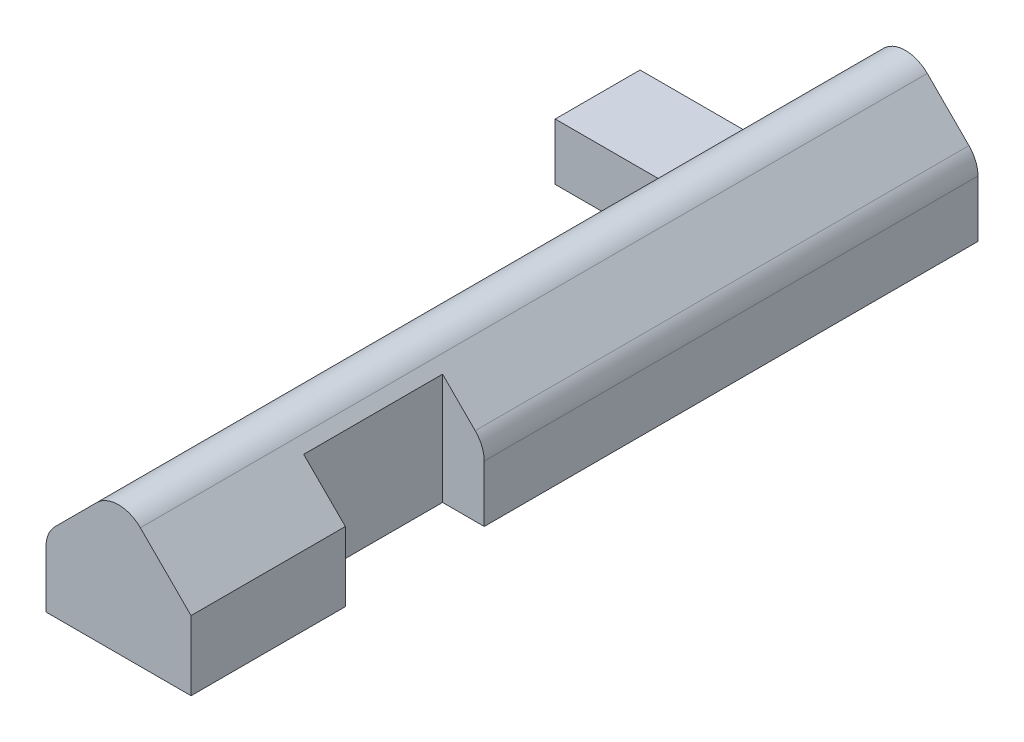
ISO-10303-21;
HEADER;
FILE_DESCRIPTION(('STEP AP214'),'2;1');
FILE_NAME('part.step','',(''),(''),'','','');
FILE_SCHEMA(('AUTOMOTIVE_DESIGN { 1 0 10303 214 1 1 1 1 }'));
ENDSEC;
DATA;
#1=APPLICATION_CONTEXT('core data for automotive mechanical design processes');
#2=APPLICATION_PROTOCOL_DEFINITION('international standard','automotive_design',2000,#1);
#3=PRODUCT_CONTEXT('',#1,'mechanical');
#4=PRODUCT('Part','Part','',(#3));
#5=PRODUCT_RELATED_PRODUCT_CATEGORY('part','',(#4));
#6=PRODUCT_DEFINITION_FORMATION('','',#4);
#7=PRODUCT_DEFINITION_CONTEXT('part definition',#1,'design');
#8=PRODUCT_DEFINITION('design','',#6,#7);
#9=PRODUCT_DEFINITION_SHAPE('','',#8);
#10=(LENGTH_UNIT() NAMED_UNIT(*) SI_UNIT(.MILLI.,.METRE.));
#11=(NAMED_UNIT(*) PLANE_ANGLE_UNIT() SI_UNIT($,.RADIAN.));
#12=(NAMED_UNIT(*) SI_UNIT($,.STERADIAN.) SOLID_ANGLE_UNIT());
#13=UNCERTAINTY_MEASURE_WITH_UNIT(LENGTH_MEASURE(1.E-05),#10,'distance_accuracy_value','');
#14=(GEOMETRIC_REPRESENTATION_CONTEXT(3) GLOBAL_UNCERTAINTY_ASSIGNED_CONTEXT((#13)) GLOBAL_UNIT_ASSIGNED_CONTEXT((#10,
#11,#12)) REPRESENTATION_CONTEXT('',''));
#15=CARTESIAN_POINT('',(0.,0.,0.));
#16=DIRECTION('',(0.,0.,1.));
#17=DIRECTION('',(1.,0.,0.));
#18=AXIS2_PLACEMENT_3D('',#15,#16,#17);
#19=CARTESIAN_POINT('',(-4.7,0.,51.));
#20=DIRECTION('',(1.,0.,0.));
#21=DIRECTION('',(0.,0.,-1.));
#22=AXIS2_PLACEMENT_3D('',#19,#20,#21);
#23=PLANE('',#22);
#24=DIRECTION('',(0.,0.,-1.));
#25=VECTOR('',#24,1.);
#26=CARTESIAN_POINT('',(-4.7,-2.25,51.));
#27=LINE('',#26,#25);
#28=CARTESIAN_POINT('',(-4.7,-2.25,5.));
#29=VERTEX_POINT('',#28);
#30=CARTESIAN_POINT('',(-4.7,-2.25,0.));
#31=VERTEX_POINT('',#30);
#32=EDGE_CURVE('E56',#29,#31,#27,.T.);
#33=ORIENTED_EDGE('',*,*,#32,.F.);
#34=DIRECTION('',(0.,-1.,0.));
#35=VECTOR('',#34,1.);
#36=CARTESIAN_POINT('',(-4.7,1.42157287525381,5.));
#37=LINE('',#36,#35);
#38=CARTESIAN_POINT('',(-4.7,1.42157287525381,5.));
#39=VERTEX_POINT('',#38);
#40=EDGE_CURVE('E189',#39,#29,#37,.T.);
#41=ORIENTED_EDGE('',*,*,#40,.F.);
#42=DIRECTION('',(0.,0.,-1.));
#43=VECTOR('',#42,1.);
#44=CARTESIAN_POINT('',(-4.7,1.42157287525381,0.));
#45=LINE('',#44,#43);
#46=CARTESIAN_POINT('',(-4.7,1.42157287525381,0.));
#47=VERTEX_POINT('',#46);
#48=EDGE_CURVE('E267',#39,#47,#45,.T.);
#49=ORIENTED_EDGE('',*,*,#48,.T.);
#50=DIRECTION('',(0.,-1.,0.));
#51=VECTOR('',#50,1.);
#52=CARTESIAN_POINT('',(-4.7,0.,0.));
#53=LINE('',#52,#51);
#54=EDGE_CURVE('E232',#47,#31,#53,.T.);
#55=ORIENTED_EDGE('',*,*,#54,.T.);
#56=EDGE_LOOP('',(#33,#41,#49,#55));
#57=FACE_BOUND('',#56,.T.);
#58=ADVANCED_FACE('F41',(#57),#23,.F.);
#59=CARTESIAN_POINT('',(3.47500000000001,3.475,51.));
#60=DIRECTION('',(0.707106781186549,0.707106781186546,0.));
#61=DIRECTION('',(-0.707106781186546,0.707106781186549,0.));
#62=AXIS2_PLACEMENT_3D('',#59,#60,#61);
#63=PLANE('',#62);
#64=DIRECTION('',(-0.707106781186546,0.707106781186549,0.));
#65=VECTOR('',#64,1.);
#66=CARTESIAN_POINT('',(3.47500000000001,3.475,32.));
#67=LINE('',#66,#65);
#68=CARTESIAN_POINT('',(4.1142135623731,2.83578643762691,32.));
#69=VERTEX_POINT('',#68);
#70=CARTESIAN_POINT('',(2.,4.95000000000001,32.));
#71=VERTEX_POINT('',#70);
#72=EDGE_CURVE('E204',#69,#71,#67,.T.);
#73=ORIENTED_EDGE('',*,*,#72,.F.);
#74=DIRECTION('',(0.,0.,-1.));
#75=VECTOR('',#74,1.);
#76=CARTESIAN_POINT('',(4.1142135623731,2.83578643762691,51.));
#77=LINE('',#76,#75);
#78=CARTESIAN_POINT('',(4.1142135623731,2.83578643762691,0.));
#79=VERTEX_POINT('',#78);
#80=EDGE_CURVE('E254',#69,#79,#77,.T.);
#81=ORIENTED_EDGE('',*,*,#80,.T.);
#82=DIRECTION('',(0.707106781186546,-0.707106781186549,0.));
#83=VECTOR('',#82,1.);
#84=CARTESIAN_POINT('',(3.47500000000001,3.475,0.));
#85=LINE('',#84,#83);
#86=CARTESIAN_POINT('',(1.4142135623731,5.53578643762692,0.));
#87=VERTEX_POINT('',#86);
#88=EDGE_CURVE('E212',#87,#79,#85,.T.);
#89=ORIENTED_EDGE('',*,*,#88,.F.);
#90=DIRECTION('',(0.,0.,-1.));
#91=VECTOR('',#90,1.);
#92=CARTESIAN_POINT('',(1.4142135623731,5.53578643762692,51.));
#93=LINE('',#92,#91);
#94=CARTESIAN_POINT('',(1.4142135623731,5.53578643762692,51.));
#95=VERTEX_POINT('',#94);
#96=EDGE_CURVE('E252',#87,#95,#93,.F.);
#97=ORIENTED_EDGE('',*,*,#96,.T.);
#98=DIRECTION('',(0.707106781186546,-0.707106781186549,0.));
#99=VECTOR('',#98,1.);
#100=CARTESIAN_POINT('',(3.47500000000001,3.475,51.));
#101=LINE('',#100,#99);
#102=CARTESIAN_POINT('',(4.7,2.25,51.));
#103=VERTEX_POINT('',#102);
#104=EDGE_CURVE('E213',#95,#103,#101,.T.);
#105=ORIENTED_EDGE('',*,*,#104,.T.);
#106=DIRECTION('',(0.,0.,-1.));
#107=VECTOR('',#106,1.);
#108=CARTESIAN_POINT('',(4.7,2.25,51.));
#109=LINE('',#108,#107);
#110=CARTESIAN_POINT('',(4.7,2.25,41.));
#111=VERTEX_POINT('',#110);
#112=EDGE_CURVE('E226',#103,#111,#109,.T.);
#113=ORIENTED_EDGE('',*,*,#112,.T.);
#114=DIRECTION('',(-0.707106781186546,0.707106781186549,0.));
#115=VECTOR('',#114,1.);
#116=CARTESIAN_POINT('',(3.47500000000001,3.475,41.));
#117=LINE('',#116,#115);
#118=CARTESIAN_POINT('',(2.,4.95000000000001,41.));
#119=VERTEX_POINT('',#118);
#120=EDGE_CURVE('E207',#111,#119,#117,.T.);
#121=ORIENTED_EDGE('',*,*,#120,.T.);
#122=DIRECTION('',(0.,0.,1.));
#123=VECTOR('',#122,1.);
#124=CARTESIAN_POINT('',(2.,4.95000000000002,51.));
#125=LINE('',#124,#123);
#126=EDGE_CURVE('E210',#71,#119,#125,.T.);
#127=ORIENTED_EDGE('',*,*,#126,.F.);
#128=EDGE_LOOP('',(#73,#81,#89,#97,#105,#113,#121,#127));
#129=FACE_BOUND('',#128,.T.);
#130=ADVANCED_FACE('F293',(#129),#63,.T.);
#131=CARTESIAN_POINT('',(0.,-2.25,51.));
#132=DIRECTION('',(0.,1.,0.));
#133=DIRECTION('',(-1.,0.,0.));
#134=AXIS2_PLACEMENT_3D('',#131,#132,#133);
#135=PLANE('',#134);
#136=DIRECTION('',(1.,0.,0.));
#137=VECTOR('',#136,1.);
#138=CARTESIAN_POINT('',(0.,-2.25,41.));
#139=LINE('',#138,#137);
#140=CARTESIAN_POINT('',(2.,-2.25,41.));
#141=VERTEX_POINT('',#140);
#142=CARTESIAN_POINT('',(4.7,-2.25,41.));
#143=VERTEX_POINT('',#142);
#144=EDGE_CURVE('E191',#141,#143,#139,.T.);
#145=ORIENTED_EDGE('',*,*,#144,.T.);
#146=DIRECTION('',(0.,0.,-1.));
#147=VECTOR('',#146,1.);
#148=CARTESIAN_POINT('',(4.7,-2.25,51.));
#149=LINE('',#148,#147);
#150=CARTESIAN_POINT('',(4.7,-2.25,51.));
#151=VERTEX_POINT('',#150);
#152=EDGE_CURVE('E241',#151,#143,#149,.T.);
#153=ORIENTED_EDGE('',*,*,#152,.F.);
#154=DIRECTION('',(1.,0.,0.));
#155=VECTOR('',#154,1.);
#156=CARTESIAN_POINT('',(0.,-2.25,51.));
#157=LINE('',#156,#155);
#158=CARTESIAN_POINT('',(-4.7,-2.25,51.));
#159=VERTEX_POINT('',#158);
#160=EDGE_CURVE('E221',#159,#151,#157,.T.);
#161=ORIENTED_EDGE('',*,*,#160,.F.);
#162=CARTESIAN_POINT('',(-4.7,-2.25,10.5));
#163=VERTEX_POINT('',#162);
#164=EDGE_CURVE('E244',#159,#163,#27,.T.);
#165=ORIENTED_EDGE('',*,*,#164,.T.);
#166=DIRECTION('',(-1.,0.,0.));
#167=VECTOR('',#166,1.);
#168=CARTESIAN_POINT('',(-4.7,-2.25,10.5));
#169=LINE('',#168,#167);
#170=CARTESIAN_POINT('',(-12.2,-2.25,10.5));
#171=VERTEX_POINT('',#170);
#172=EDGE_CURVE('E184',#163,#171,#169,.T.);
#173=ORIENTED_EDGE('',*,*,#172,.T.);
#174=DIRECTION('',(0.,0.,-1.));
#175=VECTOR('',#174,1.);
#176=CARTESIAN_POINT('',(-12.2,-2.25,5.));
#177=LINE('',#176,#175);
#178=CARTESIAN_POINT('',(-12.2,-2.25,5.));
#179=VERTEX_POINT('',#178);
#180=EDGE_CURVE('E162',#171,#179,#177,.T.);
#181=ORIENTED_EDGE('',*,*,#180,.T.);
#182=DIRECTION('',(1.,0.,0.));
#183=VECTOR('',#182,1.);
#184=CARTESIAN_POINT('',(-4.7,-2.25,5.));
#185=LINE('',#184,#183);
#186=EDGE_CURVE('E180',#179,#29,#185,.T.);
#187=ORIENTED_EDGE('',*,*,#186,.T.);
#188=ORIENTED_EDGE('',*,*,#32,.T.);
#189=DIRECTION('',(1.,0.,0.));
#190=VECTOR('',#189,1.);
#191=CARTESIAN_POINT('',(0.,-2.25,0.));
#192=LINE('',#191,#190);
#193=CARTESIAN_POINT('',(4.7,-2.25,0.));
#194=VERTEX_POINT('',#193);
#195=EDGE_CURVE('E234',#31,#194,#192,.T.);
#196=ORIENTED_EDGE('',*,*,#195,.T.);
#197=CARTESIAN_POINT('',(4.7,-2.25,32.));
#198=VERTEX_POINT('',#197);
#199=EDGE_CURVE('E240',#198,#194,#149,.T.);
#200=ORIENTED_EDGE('',*,*,#199,.F.);
#201=DIRECTION('',(1.,0.,0.));
#202=VECTOR('',#201,1.);
#203=CARTESIAN_POINT('',(0.,-2.25,32.));
#204=LINE('',#203,#202);
#205=CARTESIAN_POINT('',(2.,-2.25,32.));
#206=VERTEX_POINT('',#205);
#207=EDGE_CURVE('E199',#206,#198,#204,.T.);
#208=ORIENTED_EDGE('',*,*,#207,.F.);
#209=DIRECTION('',(0.,0.,-1.));
#210=VECTOR('',#209,1.);
#211=CARTESIAN_POINT('',(2.,-2.25,0.));
#212=LINE('',#211,#210);
#213=EDGE_CURVE('E196',#141,#206,#212,.T.);
#214=ORIENTED_EDGE('',*,*,#213,.F.);
#215=EDGE_LOOP('',(#145,#153,#161,#165,#173,#181,#187,#188,#196,#200,#208,#214));
#216=FACE_BOUND('',#215,.T.);
#217=ADVANCED_FACE('F309',(#216),#135,.F.);
#218=CARTESIAN_POINT('',(4.7,0.,51.));
#219=DIRECTION('',(1.,0.,0.));
#220=DIRECTION('',(0.,0.,-1.));
#221=AXIS2_PLACEMENT_3D('',#218,#219,#220);
#222=PLANE('',#221);
#223=ORIENTED_EDGE('',*,*,#152,.T.);
#224=DIRECTION('',(0.,1.,0.));
#225=VECTOR('',#224,1.);
#226=CARTESIAN_POINT('',(4.7,0.,41.));
#227=LINE('',#226,#225);
#228=EDGE_CURVE('E249',#143,#111,#227,.T.);
#229=ORIENTED_EDGE('',*,*,#228,.T.);
#230=ORIENTED_EDGE('',*,*,#112,.F.);
#231=DIRECTION('',(0.,-1.,0.));
#232=VECTOR('',#231,1.);
#233=CARTESIAN_POINT('',(4.7,0.,51.));
#234=LINE('',#233,#232);
#235=EDGE_CURVE('E223',#103,#151,#234,.T.);
#236=ORIENTED_EDGE('',*,*,#235,.T.);
#237=EDGE_LOOP('',(#223,#229,#230,#236));
#238=FACE_BOUND('',#237,.T.);
#239=ADVANCED_FACE('F321',(#238),#222,.T.);
#240=CARTESIAN_POINT('',(-3.47500000000001,3.475,51.));
#241=DIRECTION('',(-0.707106781186549,0.707106781186546,0.));
#242=DIRECTION('',(-0.707106781186546,-0.707106781186549,0.));
#243=AXIS2_PLACEMENT_3D('',#240,#241,#242);
#244=PLANE('',#243);
#245=DIRECTION('',(0.707106781186546,0.707106781186549,0.));
#246=VECTOR('',#245,1.);
#247=CARTESIAN_POINT('',(-3.47500000000001,3.475,0.));
#248=LINE('',#247,#246);
#249=CARTESIAN_POINT('',(-4.1142135623731,2.83578643762691,0.));
#250=VERTEX_POINT('',#249);
#251=CARTESIAN_POINT('',(-1.4142135623731,5.53578643762692,0.));
#252=VERTEX_POINT('',#251);
#253=EDGE_CURVE('E229',#250,#252,#248,.T.);
#254=ORIENTED_EDGE('',*,*,#253,.F.);
#255=DIRECTION('',(0.,0.,-1.));
#256=VECTOR('',#255,1.);
#257=CARTESIAN_POINT('',(-4.1142135623731,2.83578643762691,51.));
#258=LINE('',#257,#256);
#259=CARTESIAN_POINT('',(-4.1142135623731,2.83578643762691,51.));
#260=VERTEX_POINT('',#259);
#261=EDGE_CURVE('E273',#250,#260,#258,.F.);
#262=ORIENTED_EDGE('',*,*,#261,.T.);
#263=DIRECTION('',(0.707106781186546,0.707106781186549,0.));
#264=VECTOR('',#263,1.);
#265=CARTESIAN_POINT('',(-3.47500000000001,3.475,51.));
#266=LINE('',#265,#264);
#267=CARTESIAN_POINT('',(-1.4142135623731,5.53578643762692,51.));
#268=VERTEX_POINT('',#267);
#269=EDGE_CURVE('E215',#260,#268,#266,.T.);
#270=ORIENTED_EDGE('',*,*,#269,.T.);
#271=DIRECTION('',(0.,0.,-1.));
#272=VECTOR('',#271,1.);
#273=CARTESIAN_POINT('',(-1.4142135623731,5.53578643762692,51.));
#274=LINE('',#273,#272);
#275=EDGE_CURVE('E270',#268,#252,#274,.T.);
#276=ORIENTED_EDGE('',*,*,#275,.T.);
#277=EDGE_LOOP('',(#254,#262,#270,#276));
#278=FACE_BOUND('',#277,.T.);
#279=ADVANCED_FACE('F286',(#278),#244,.T.);
#280=CARTESIAN_POINT('',(-4.7,1.42157287525381,51.));
#281=VERTEX_POINT('',#280);
#282=CARTESIAN_POINT('',(-4.7,1.42157287525381,10.5));
#283=VERTEX_POINT('',#282);
#284=EDGE_CURVE('E268',#281,#283,#45,.T.);
#285=ORIENTED_EDGE('',*,*,#284,.T.);
#286=DIRECTION('',(0.,-1.,0.));
#287=VECTOR('',#286,1.);
#288=CARTESIAN_POINT('',(-4.7,1.42157287525381,10.5));
#289=LINE('',#288,#287);
#290=EDGE_CURVE('E64',#283,#163,#289,.T.);
#291=ORIENTED_EDGE('',*,*,#290,.T.);
#292=ORIENTED_EDGE('',*,*,#164,.F.);
#293=DIRECTION('',(0.,-1.,0.));
#294=VECTOR('',#293,1.);
#295=CARTESIAN_POINT('',(-4.7,0.,51.));
#296=LINE('',#295,#294);
#297=EDGE_CURVE('E219',#281,#159,#296,.T.);
#298=ORIENTED_EDGE('',*,*,#297,.F.);
#299=EDGE_LOOP('',(#285,#291,#292,#298));
#300=FACE_BOUND('',#299,.T.);
#301=ADVANCED_FACE('F316',(#300),#23,.F.);
#302=DIRECTION('',(0.,-1.,0.));
#303=VECTOR('',#302,1.);
#304=CARTESIAN_POINT('',(4.7,0.,0.));
#305=LINE('',#304,#303);
#306=CARTESIAN_POINT('',(4.7,1.42157287525381,0.));
#307=VERTEX_POINT('',#306);
#308=EDGE_CURVE('E216',#307,#194,#305,.T.);
#309=ORIENTED_EDGE('',*,*,#308,.F.);
#310=DIRECTION('',(0.,0.,-1.));
#311=VECTOR('',#310,1.);
#312=CARTESIAN_POINT('',(4.7,1.42157287525381,51.));
#313=LINE('',#312,#311);
#314=CARTESIAN_POINT('',(4.7,1.42157287525381,32.));
#315=VERTEX_POINT('',#314);
#316=EDGE_CURVE('E263',#307,#315,#313,.F.);
#317=ORIENTED_EDGE('',*,*,#316,.T.);
#318=DIRECTION('',(0.,1.,0.));
#319=VECTOR('',#318,1.);
#320=CARTESIAN_POINT('',(4.7,0.,32.));
#321=LINE('',#320,#319);
#322=EDGE_CURVE('E246',#198,#315,#321,.T.);
#323=ORIENTED_EDGE('',*,*,#322,.F.);
#324=ORIENTED_EDGE('',*,*,#199,.T.);
#325=EDGE_LOOP('',(#309,#317,#323,#324));
#326=FACE_BOUND('',#325,.T.);
#327=ADVANCED_FACE('F304',(#326),#222,.T.);
#328=CARTESIAN_POINT('',(0.,0.,51.));
#329=DIRECTION('',(0.,0.,1.));
#330=DIRECTION('',(1.,0.,0.));
#331=AXIS2_PLACEMENT_3D('',#328,#329,#330);
#332=PLANE('',#331);
#333=ORIENTED_EDGE('',*,*,#269,.F.);
#334=CARTESIAN_POINT('',(-2.7,1.42157287525381,51.));
#335=DIRECTION('',(0.,0.,1.));
#336=DIRECTION('',(1.,0.,0.));
#337=AXIS2_PLACEMENT_3D('',#334,#335,#336);
#338=CIRCLE('',#337,2.);
#339=EDGE_CURVE('E11',#260,#281,#338,.T.);
#340=ORIENTED_EDGE('',*,*,#339,.T.);
#341=ORIENTED_EDGE('',*,*,#297,.T.);
#342=ORIENTED_EDGE('',*,*,#160,.T.);
#343=ORIENTED_EDGE('',*,*,#235,.F.);
#344=ORIENTED_EDGE('',*,*,#104,.F.);
#345=CARTESIAN_POINT('',(0.,4.12157287525382,51.));
#346=DIRECTION('',(0.,0.,1.));
#347=DIRECTION('',(1.,0.,0.));
#348=AXIS2_PLACEMENT_3D('',#345,#346,#347);
#349=CIRCLE('',#348,2.);
#350=EDGE_CURVE('E49',#95,#268,#349,.T.);
#351=ORIENTED_EDGE('',*,*,#350,.T.);
#352=EDGE_LOOP('',(#333,#340,#341,#342,#343,#344,#351));
#353=FACE_BOUND('',#352,.T.);
#354=ADVANCED_FACE('F278',(#353),#332,.T.);
#355=CARTESIAN_POINT('',(0.,0.,0.));
#356=DIRECTION('',(0.,0.,1.));
#357=DIRECTION('',(1.,0.,0.));
#358=AXIS2_PLACEMENT_3D('',#355,#356,#357);
#359=PLANE('',#358);
#360=ORIENTED_EDGE('',*,*,#88,.T.);
#361=CARTESIAN_POINT('',(2.7,1.42157287525381,0.));
#362=DIRECTION('',(0.,0.,1.));
#363=DIRECTION('',(1.,0.,0.));
#364=AXIS2_PLACEMENT_3D('',#361,#362,#363);
#365=CIRCLE('',#364,2.);
#366=EDGE_CURVE('E261',#79,#307,#365,.F.);
#367=ORIENTED_EDGE('',*,*,#366,.T.);
#368=ORIENTED_EDGE('',*,*,#308,.T.);
#369=ORIENTED_EDGE('',*,*,#195,.F.);
#370=ORIENTED_EDGE('',*,*,#54,.F.);
#371=CARTESIAN_POINT('',(-2.7,1.42157287525381,0.));
#372=DIRECTION('',(0.,0.,1.));
#373=DIRECTION('',(1.,0.,0.));
#374=AXIS2_PLACEMENT_3D('',#371,#372,#373);
#375=CIRCLE('',#374,2.);
#376=EDGE_CURVE('E259',#47,#250,#375,.F.);
#377=ORIENTED_EDGE('',*,*,#376,.T.);
#378=ORIENTED_EDGE('',*,*,#253,.T.);
#379=CARTESIAN_POINT('',(0.,4.12157287525382,0.));
#380=DIRECTION('',(0.,0.,1.));
#381=DIRECTION('',(1.,0.,0.));
#382=AXIS2_PLACEMENT_3D('',#379,#380,#381);
#383=CIRCLE('',#382,2.);
#384=EDGE_CURVE('E257',#252,#87,#383,.F.);
#385=ORIENTED_EDGE('',*,*,#384,.T.);
#386=EDGE_LOOP('',(#360,#367,#368,#369,#370,#377,#378,#385));
#387=FACE_BOUND('',#386,.T.);
#388=ADVANCED_FACE('F290',(#387),#359,.F.);
#389=CARTESIAN_POINT('',(0.,7.75,41.));
#390=DIRECTION('',(0.,0.,-1.));
#391=DIRECTION('',(-1.,0.,0.));
#392=AXIS2_PLACEMENT_3D('',#389,#390,#391);
#393=PLANE('',#392);
#394=ORIENTED_EDGE('',*,*,#228,.F.);
#395=ORIENTED_EDGE('',*,*,#144,.F.);
#396=DIRECTION('',(0.,-1.,0.));
#397=VECTOR('',#396,1.);
#398=CARTESIAN_POINT('',(2.,7.75,41.));
#399=LINE('',#398,#397);
#400=EDGE_CURVE('E201',#119,#141,#399,.T.);
#401=ORIENTED_EDGE('',*,*,#400,.F.);
#402=ORIENTED_EDGE('',*,*,#120,.F.);
#403=EDGE_LOOP('',(#394,#395,#401,#402));
#404=FACE_BOUND('',#403,.T.);
#405=ADVANCED_FACE('F324',(#404),#393,.T.);
#406=CARTESIAN_POINT('',(0.,7.75,32.));
#407=DIRECTION('',(0.,0.,-1.));
#408=DIRECTION('',(-1.,0.,0.));
#409=AXIS2_PLACEMENT_3D('',#406,#407,#408);
#410=PLANE('',#409);
#411=ORIENTED_EDGE('',*,*,#322,.T.);
#412=CARTESIAN_POINT('',(2.7,1.42157287525381,32.));
#413=DIRECTION('',(0.,0.,-1.));
#414=DIRECTION('',(-1.,0.,0.));
#415=AXIS2_PLACEMENT_3D('',#412,#413,#414);
#416=CIRCLE('',#415,2.);
#417=EDGE_CURVE('E265',#315,#69,#416,.F.);
#418=ORIENTED_EDGE('',*,*,#417,.T.);
#419=ORIENTED_EDGE('',*,*,#72,.T.);
#420=DIRECTION('',(0.,-1.,0.));
#421=VECTOR('',#420,1.);
#422=CARTESIAN_POINT('',(2.,7.75,32.));
#423=LINE('',#422,#421);
#424=EDGE_CURVE('E202',#71,#206,#423,.T.);
#425=ORIENTED_EDGE('',*,*,#424,.T.);
#426=ORIENTED_EDGE('',*,*,#207,.T.);
#427=EDGE_LOOP('',(#411,#418,#419,#425,#426));
#428=FACE_BOUND('',#427,.T.);
#429=ADVANCED_FACE('F331',(#428),#410,.F.);
#430=CARTESIAN_POINT('',(2.00000000000001,7.75,0.));
#431=DIRECTION('',(-1.,0.,0.));
#432=DIRECTION('',(0.,0.,1.));
#433=AXIS2_PLACEMENT_3D('',#430,#431,#432);
#434=PLANE('',#433);
#435=ORIENTED_EDGE('',*,*,#126,.T.);
#436=ORIENTED_EDGE('',*,*,#400,.T.);
#437=ORIENTED_EDGE('',*,*,#213,.T.);
#438=ORIENTED_EDGE('',*,*,#424,.F.);
#439=EDGE_LOOP('',(#435,#436,#437,#438));
#440=FACE_BOUND('',#439,.T.);
#441=ADVANCED_FACE('F328',(#440),#434,.F.);
#442=CARTESIAN_POINT('',(2.7,1.42157287525381,51.));
#443=DIRECTION('',(0.,0.,-1.));
#444=DIRECTION('',(-1.,0.,0.));
#445=AXIS2_PLACEMENT_3D('',#442,#443,#444);
#446=CYLINDRICAL_SURFACE('',#445,2.);
#447=ORIENTED_EDGE('',*,*,#417,.F.);
#448=ORIENTED_EDGE('',*,*,#316,.F.);
#449=ORIENTED_EDGE('',*,*,#366,.F.);
#450=ORIENTED_EDGE('',*,*,#80,.F.);
#451=EDGE_LOOP('',(#447,#448,#449,#450));
#452=FACE_BOUND('',#451,.T.);
#453=ADVANCED_FACE('F298',(#452),#446,.T.);
#454=CARTESIAN_POINT('',(-2.7,1.42157287525381,51.));
#455=DIRECTION('',(0.,0.,1.));
#456=DIRECTION('',(1.,0.,0.));
#457=AXIS2_PLACEMENT_3D('',#454,#455,#456);
#458=CYLINDRICAL_SURFACE('',#457,2.);
#459=ORIENTED_EDGE('',*,*,#339,.F.);
#460=ORIENTED_EDGE('',*,*,#261,.F.);
#461=ORIENTED_EDGE('',*,*,#376,.F.);
#462=ORIENTED_EDGE('',*,*,#48,.F.);
#463=DIRECTION('',(0.,0.,1.));
#464=VECTOR('',#463,1.);
#465=CARTESIAN_POINT('',(-4.7,1.42157287525381,5.));
#466=LINE('',#465,#464);
#467=EDGE_CURVE('E178',#39,#283,#466,.T.);
#468=ORIENTED_EDGE('',*,*,#467,.T.);
#469=ORIENTED_EDGE('',*,*,#284,.F.);
#470=EDGE_LOOP('',(#459,#460,#461,#462,#468,#469));
#471=FACE_BOUND('',#470,.T.);
#472=ADVANCED_FACE('F313',(#471),#458,.T.);
#473=CARTESIAN_POINT('',(0.,4.12157287525382,51.));
#474=DIRECTION('',(0.,0.,-1.));
#475=DIRECTION('',(-1.,0.,0.));
#476=AXIS2_PLACEMENT_3D('',#473,#474,#475);
#477=CYLINDRICAL_SURFACE('',#476,2.);
#478=ORIENTED_EDGE('',*,*,#350,.F.);
#479=ORIENTED_EDGE('',*,*,#96,.F.);
#480=ORIENTED_EDGE('',*,*,#384,.F.);
#481=ORIENTED_EDGE('',*,*,#275,.F.);
#482=EDGE_LOOP('',(#478,#479,#480,#481));
#483=FACE_BOUND('',#482,.T.);
#484=ADVANCED_FACE('F43',(#483),#477,.T.);
#485=CARTESIAN_POINT('',(-4.7,1.42157287525381,5.));
#486=DIRECTION('',(0.,0.,-1.));
#487=DIRECTION('',(-1.,0.,0.));
#488=AXIS2_PLACEMENT_3D('',#485,#486,#487);
#489=PLANE('',#488);
#490=ORIENTED_EDGE('',*,*,#186,.F.);
#491=DIRECTION('',(0.,-1.,0.));
#492=VECTOR('',#491,1.);
#493=CARTESIAN_POINT('',(-12.2,1.42157287525381,5.));
#494=LINE('',#493,#492);
#495=CARTESIAN_POINT('',(-12.2,1.42157287525381,5.));
#496=VERTEX_POINT('',#495);
#497=EDGE_CURVE('E167',#496,#179,#494,.T.);
#498=ORIENTED_EDGE('',*,*,#497,.F.);
#499=DIRECTION('',(1.,0.,0.));
#500=VECTOR('',#499,1.);
#501=CARTESIAN_POINT('',(-4.7,1.42157287525381,5.));
#502=LINE('',#501,#500);
#503=EDGE_CURVE('E175',#496,#39,#502,.T.);
#504=ORIENTED_EDGE('',*,*,#503,.T.);
#505=ORIENTED_EDGE('',*,*,#40,.T.);
#506=EDGE_LOOP('',(#490,#498,#504,#505));
#507=FACE_BOUND('',#506,.T.);
#508=ADVANCED_FACE('F367',(#507),#489,.T.);
#509=CARTESIAN_POINT('',(-12.2,1.42157287525381,5.));
#510=DIRECTION('',(-1.,0.,0.));
#511=DIRECTION('',(0.,-1.,0.));
#512=AXIS2_PLACEMENT_3D('',#509,#510,#511);
#513=PLANE('',#512);
#514=ORIENTED_EDGE('',*,*,#180,.F.);
#515=DIRECTION('',(0.,-1.,0.));
#516=VECTOR('',#515,1.);
#517=CARTESIAN_POINT('',(-12.2,1.42157287525381,10.5));
#518=LINE('',#517,#516);
#519=CARTESIAN_POINT('',(-12.2,1.42157287525381,10.5));
#520=VERTEX_POINT('',#519);
#521=EDGE_CURVE('E156',#520,#171,#518,.T.);
#522=ORIENTED_EDGE('',*,*,#521,.F.);
#523=DIRECTION('',(0.,0.,-1.));
#524=VECTOR('',#523,1.);
#525=CARTESIAN_POINT('',(-12.2,1.42157287525381,5.));
#526=LINE('',#525,#524);
#527=EDGE_CURVE('E159',#520,#496,#526,.T.);
#528=ORIENTED_EDGE('',*,*,#527,.T.);
#529=ORIENTED_EDGE('',*,*,#497,.T.);
#530=EDGE_LOOP('',(#514,#522,#528,#529));
#531=FACE_BOUND('',#530,.T.);
#532=ADVANCED_FACE('F158',(#531),#513,.T.);
#533=CARTESIAN_POINT('',(-4.7,1.42157287525381,10.5));
#534=DIRECTION('',(0.,0.,1.));
#535=DIRECTION('',(1.,0.,0.));
#536=AXIS2_PLACEMENT_3D('',#533,#534,#535);
#537=PLANE('',#536);
#538=ORIENTED_EDGE('',*,*,#172,.F.);
#539=ORIENTED_EDGE('',*,*,#290,.F.);
#540=DIRECTION('',(-1.,0.,0.));
#541=VECTOR('',#540,1.);
#542=CARTESIAN_POINT('',(-4.7,1.42157287525381,10.5));
#543=LINE('',#542,#541);
#544=EDGE_CURVE('E173',#283,#520,#543,.T.);
#545=ORIENTED_EDGE('',*,*,#544,.T.);
#546=ORIENTED_EDGE('',*,*,#521,.T.);
#547=EDGE_LOOP('',(#538,#539,#545,#546));
#548=FACE_BOUND('',#547,.T.);
#549=ADVANCED_FACE('F177',(#548),#537,.T.);
#550=CARTESIAN_POINT('',(0.,1.42157287525381,0.));
#551=DIRECTION('',(0.,-1.,0.));
#552=DIRECTION('',(1.,0.,0.));
#553=AXIS2_PLACEMENT_3D('',#550,#551,#552);
#554=PLANE('',#553);
#555=ORIENTED_EDGE('',*,*,#467,.F.);
#556=ORIENTED_EDGE('',*,*,#503,.F.);
#557=ORIENTED_EDGE('',*,*,#527,.F.);
#558=ORIENTED_EDGE('',*,*,#544,.F.);
#559=EDGE_LOOP('',(#555,#556,#557,#558));
#560=FACE_BOUND('',#559,.T.);
#561=ADVANCED_FACE('F172',(#560),#554,.F.);
#562=CLOSED_SHELL('',(#58,#130,#217,#239,#279,#301,#327,#354,#388,#405,#429,#441,#453,#472,#484,
#508,#532,#549,#561));
#563=MANIFOLD_SOLID_BREP('B2',#562);
#564=ADVANCED_BREP_SHAPE_REPRESENTATION('',(#18,#563),#14);
#565=SHAPE_DEFINITION_REPRESENTATION(#9,#564);
ENDSEC;
END-ISO-10303-21;
